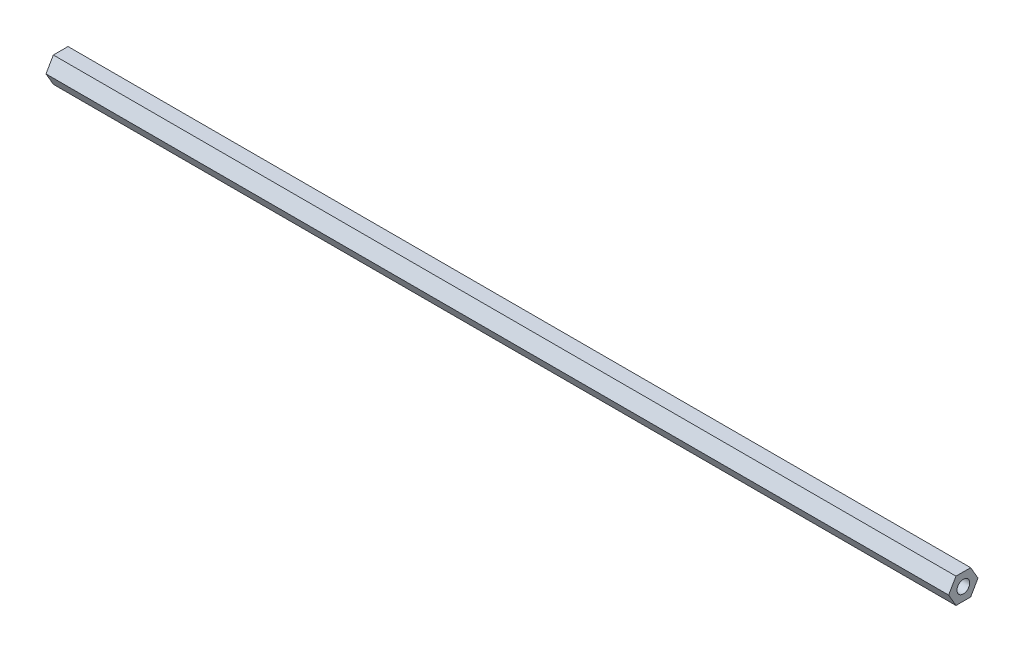
ISO-10303-21;
HEADER;
FILE_DESCRIPTION(('STEP AP214'),'2;1');
FILE_NAME('part.step','',(''),(''),'','','');
FILE_SCHEMA(('AUTOMOTIVE_DESIGN { 1 0 10303 214 1 1 1 1 }'));
ENDSEC;
DATA;
#1=APPLICATION_CONTEXT('core data for automotive mechanical design processes');
#2=APPLICATION_PROTOCOL_DEFINITION('international standard','automotive_design',2000,#1);
#3=PRODUCT_CONTEXT('',#1,'mechanical');
#4=PRODUCT('Part','Part','',(#3));
#5=PRODUCT_RELATED_PRODUCT_CATEGORY('part','',(#4));
#6=PRODUCT_DEFINITION_FORMATION('','',#4);
#7=PRODUCT_DEFINITION_CONTEXT('part definition',#1,'design');
#8=PRODUCT_DEFINITION('design','',#6,#7);
#9=PRODUCT_DEFINITION_SHAPE('','',#8);
#10=(LENGTH_UNIT() NAMED_UNIT(*) SI_UNIT(.MILLI.,.METRE.));
#11=(NAMED_UNIT(*) PLANE_ANGLE_UNIT() SI_UNIT($,.RADIAN.));
#12=(NAMED_UNIT(*) SI_UNIT($,.STERADIAN.) SOLID_ANGLE_UNIT());
#13=UNCERTAINTY_MEASURE_WITH_UNIT(LENGTH_MEASURE(1.E-05),#10,'distance_accuracy_value','');
#14=(GEOMETRIC_REPRESENTATION_CONTEXT(3) GLOBAL_UNCERTAINTY_ASSIGNED_CONTEXT((#13)) GLOBAL_UNIT_ASSIGNED_CONTEXT((#10,
#11,#12)) REPRESENTATION_CONTEXT('',''));
#15=CARTESIAN_POINT('',(0.,0.,0.));
#16=DIRECTION('',(0.,0.,1.));
#17=DIRECTION('',(1.,0.,0.));
#18=AXIS2_PLACEMENT_3D('',#15,#16,#17);
#19=CARTESIAN_POINT('',(225.425,0.,0.));
#20=DIRECTION('',(1.,0.,0.));
#21=DIRECTION('',(0.,0.,-1.));
#22=AXIS2_PLACEMENT_3D('',#19,#20,#21);
#23=PLANE('',#22);
#24=DIRECTION('',(0.,0.,1.));
#25=VECTOR('',#24,1.);
#26=CARTESIAN_POINT('',(225.425,6.35000000000005,-3.6661742093542));
#27=LINE('',#26,#25);
#28=CARTESIAN_POINT('',(225.425,6.35000000000005,-3.6661742093542));
#29=VERTEX_POINT('',#28);
#30=CARTESIAN_POINT('',(225.425,6.35000000000005,3.66617420935406));
#31=VERTEX_POINT('',#30);
#32=EDGE_CURVE('E131',#29,#31,#27,.T.);
#33=ORIENTED_EDGE('',*,*,#32,.T.);
#34=DIRECTION('',(0.,-0.866025403784436,0.500000000000004));
#35=VECTOR('',#34,1.);
#36=CARTESIAN_POINT('',(225.425,6.35000000000005,3.66617420935406));
#37=LINE('',#36,#35);
#38=CARTESIAN_POINT('',(225.425,0.,7.33234841870825));
#39=VERTEX_POINT('',#38);
#40=EDGE_CURVE('E89',#31,#39,#37,.T.);
#41=ORIENTED_EDGE('',*,*,#40,.T.);
#42=DIRECTION('',(0.,-0.866025403784429,-0.500000000000017));
#43=VECTOR('',#42,1.);
#44=CARTESIAN_POINT('',(225.425,0.,7.33234841870825));
#45=LINE('',#44,#43);
#46=CARTESIAN_POINT('',(225.425,-6.34999999999997,3.66617420935397));
#47=VERTEX_POINT('',#46);
#48=EDGE_CURVE('E102',#39,#47,#45,.T.);
#49=ORIENTED_EDGE('',*,*,#48,.T.);
#50=DIRECTION('',(0.,0.,-1.));
#51=VECTOR('',#50,1.);
#52=CARTESIAN_POINT('',(225.425,-6.34999999999997,3.66617420935397));
#53=LINE('',#52,#51);
#54=CARTESIAN_POINT('',(225.425,-6.34999999999999,-3.6661742093542));
#55=VERTEX_POINT('',#54);
#56=EDGE_CURVE('E96',#47,#55,#53,.T.);
#57=ORIENTED_EDGE('',*,*,#56,.T.);
#58=DIRECTION('',(0.,0.866025403784438,-0.5));
#59=VECTOR('',#58,1.);
#60=CARTESIAN_POINT('',(225.425,-6.34999999999999,-3.6661742093542));
#61=LINE('',#60,#59);
#62=CARTESIAN_POINT('',(225.425,0.,-7.33234841870833));
#63=VERTEX_POINT('',#62);
#64=EDGE_CURVE('E100',#55,#63,#61,.T.);
#65=ORIENTED_EDGE('',*,*,#64,.T.);
#66=DIRECTION('',(0.,0.866025403784438,0.5));
#67=VECTOR('',#66,1.);
#68=CARTESIAN_POINT('',(225.425,0.,-7.33234841870833));
#69=LINE('',#68,#67);
#70=EDGE_CURVE('E52',#63,#29,#69,.T.);
#71=ORIENTED_EDGE('',*,*,#70,.T.);
#72=EDGE_LOOP('',(#33,#41,#49,#57,#65,#71));
#73=FACE_BOUND('',#72,.T.);
#74=CARTESIAN_POINT('',(225.425,0.,0.));
#75=DIRECTION('',(1.,0.,0.));
#76=DIRECTION('',(0.,0.,-1.));
#77=AXIS2_PLACEMENT_3D('',#74,#75,#76);
#78=CIRCLE('',#77,3.17500000000001);
#79=CARTESIAN_POINT('',(225.425,0.,3.17500000000001));
#80=VERTEX_POINT('',#79);
#81=EDGE_CURVE('E124',#80,#80,#78,.T.);
#82=ORIENTED_EDGE('',*,*,#81,.F.);
#83=EDGE_LOOP('',(#82));
#84=FACE_BOUND('',#83,.T.);
#85=ADVANCED_FACE('F35',(#73,#84),#23,.T.);
#86=CARTESIAN_POINT('',(-225.425,0.,0.));
#87=DIRECTION('',(1.,0.,0.));
#88=DIRECTION('',(0.,0.,-1.));
#89=AXIS2_PLACEMENT_3D('',#86,#87,#88);
#90=PLANE('',#89);
#91=DIRECTION('',(0.,0.,1.));
#92=VECTOR('',#91,1.);
#93=CARTESIAN_POINT('',(-225.425,6.35000000000005,-3.6661742093542));
#94=LINE('',#93,#92);
#95=CARTESIAN_POINT('',(-225.425,6.35000000000005,-3.6661742093542));
#96=VERTEX_POINT('',#95);
#97=CARTESIAN_POINT('',(-225.425,6.35000000000005,3.66617420935406));
#98=VERTEX_POINT('',#97);
#99=EDGE_CURVE('E120',#96,#98,#94,.T.);
#100=ORIENTED_EDGE('',*,*,#99,.F.);
#101=DIRECTION('',(0.,0.866025403784438,0.5));
#102=VECTOR('',#101,1.);
#103=CARTESIAN_POINT('',(-225.425,0.,-7.33234841870833));
#104=LINE('',#103,#102);
#105=CARTESIAN_POINT('',(-225.425,0.,-7.33234841870833));
#106=VERTEX_POINT('',#105);
#107=EDGE_CURVE('E81',#106,#96,#104,.T.);
#108=ORIENTED_EDGE('',*,*,#107,.F.);
#109=DIRECTION('',(0.,0.866025403784438,-0.5));
#110=VECTOR('',#109,1.);
#111=CARTESIAN_POINT('',(-225.425,-6.34999999999999,-3.6661742093542));
#112=LINE('',#111,#110);
#113=CARTESIAN_POINT('',(-225.425,-6.34999999999999,-3.6661742093542));
#114=VERTEX_POINT('',#113);
#115=EDGE_CURVE('E75',#114,#106,#112,.T.);
#116=ORIENTED_EDGE('',*,*,#115,.F.);
#117=DIRECTION('',(0.,0.,-1.));
#118=VECTOR('',#117,1.);
#119=CARTESIAN_POINT('',(-225.425,-6.34999999999997,3.66617420935397));
#120=LINE('',#119,#118);
#121=CARTESIAN_POINT('',(-225.425,-6.34999999999997,3.66617420935397));
#122=VERTEX_POINT('',#121);
#123=EDGE_CURVE('E110',#122,#114,#120,.T.);
#124=ORIENTED_EDGE('',*,*,#123,.F.);
#125=DIRECTION('',(0.,-0.866025403784429,-0.500000000000017));
#126=VECTOR('',#125,1.);
#127=CARTESIAN_POINT('',(-225.425,0.,7.33234841870825));
#128=LINE('',#127,#126);
#129=CARTESIAN_POINT('',(-225.425,0.,7.33234841870825));
#130=VERTEX_POINT('',#129);
#131=EDGE_CURVE('E126',#130,#122,#128,.T.);
#132=ORIENTED_EDGE('',*,*,#131,.F.);
#133=DIRECTION('',(0.,-0.866025403784436,0.500000000000004));
#134=VECTOR('',#133,1.);
#135=CARTESIAN_POINT('',(-225.425,6.35000000000005,3.66617420935406));
#136=LINE('',#135,#134);
#137=EDGE_CURVE('E123',#98,#130,#136,.T.);
#138=ORIENTED_EDGE('',*,*,#137,.F.);
#139=EDGE_LOOP('',(#100,#108,#116,#124,#132,#138));
#140=FACE_BOUND('',#139,.T.);
#141=CARTESIAN_POINT('',(-225.425,0.,0.));
#142=DIRECTION('',(1.,0.,0.));
#143=DIRECTION('',(0.,0.,-1.));
#144=AXIS2_PLACEMENT_3D('',#141,#142,#143);
#145=CIRCLE('',#144,3.17500000000001);
#146=CARTESIAN_POINT('',(-225.425,0.,3.17500000000001));
#147=VERTEX_POINT('',#146);
#148=EDGE_CURVE('E224',#147,#147,#145,.T.);
#149=ORIENTED_EDGE('',*,*,#148,.T.);
#150=EDGE_LOOP('',(#149));
#151=FACE_BOUND('',#150,.T.);
#152=ADVANCED_FACE('F140',(#140,#151),#90,.F.);
#153=CARTESIAN_POINT('',(225.425,6.35000000000005,-3.6661742093542));
#154=DIRECTION('',(0.,-1.,0.));
#155=DIRECTION('',(0.,0.,-1.));
#156=AXIS2_PLACEMENT_3D('',#153,#154,#155);
#157=PLANE('',#156);
#158=ORIENTED_EDGE('',*,*,#99,.T.);
#159=DIRECTION('',(-1.,0.,0.));
#160=VECTOR('',#159,1.);
#161=CARTESIAN_POINT('',(225.425,6.35000000000005,3.66617420935406));
#162=LINE('',#161,#160);
#163=EDGE_CURVE('E11',#31,#98,#162,.T.);
#164=ORIENTED_EDGE('',*,*,#163,.F.);
#165=ORIENTED_EDGE('',*,*,#32,.F.);
#166=DIRECTION('',(-1.,0.,0.));
#167=VECTOR('',#166,1.);
#168=CARTESIAN_POINT('',(225.425,6.35000000000005,-3.6661742093542));
#169=LINE('',#168,#167);
#170=EDGE_CURVE('E116',#29,#96,#169,.T.);
#171=ORIENTED_EDGE('',*,*,#170,.T.);
#172=EDGE_LOOP('',(#158,#164,#165,#171));
#173=FACE_BOUND('',#172,.T.);
#174=ADVANCED_FACE('F37',(#173),#157,.F.);
#175=CARTESIAN_POINT('',(225.425,6.35000000000005,3.66617420935406));
#176=DIRECTION('',(0.,-0.500000000000004,-0.866025403784436));
#177=DIRECTION('',(0.,0.866025403784436,-0.500000000000004));
#178=AXIS2_PLACEMENT_3D('',#175,#176,#177);
#179=PLANE('',#178);
#180=ORIENTED_EDGE('',*,*,#137,.T.);
#181=DIRECTION('',(-1.,0.,0.));
#182=VECTOR('',#181,1.);
#183=CARTESIAN_POINT('',(225.425,0.,7.33234841870825));
#184=LINE('',#183,#182);
#185=EDGE_CURVE('E44',#39,#130,#184,.T.);
#186=ORIENTED_EDGE('',*,*,#185,.F.);
#187=ORIENTED_EDGE('',*,*,#40,.F.);
#188=ORIENTED_EDGE('',*,*,#163,.T.);
#189=EDGE_LOOP('',(#180,#186,#187,#188));
#190=FACE_BOUND('',#189,.T.);
#191=ADVANCED_FACE('F165',(#190),#179,.F.);
#192=CARTESIAN_POINT('',(225.425,0.,7.33234841870825));
#193=DIRECTION('',(0.,0.500000000000017,-0.866025403784429));
#194=DIRECTION('',(0.,0.866025403784429,0.500000000000017));
#195=AXIS2_PLACEMENT_3D('',#192,#193,#194);
#196=PLANE('',#195);
#197=ORIENTED_EDGE('',*,*,#131,.T.);
#198=DIRECTION('',(-1.,0.,0.));
#199=VECTOR('',#198,1.);
#200=CARTESIAN_POINT('',(225.425,-6.34999999999997,3.66617420935397));
#201=LINE('',#200,#199);
#202=EDGE_CURVE('E111',#47,#122,#201,.T.);
#203=ORIENTED_EDGE('',*,*,#202,.F.);
#204=ORIENTED_EDGE('',*,*,#48,.F.);
#205=ORIENTED_EDGE('',*,*,#185,.T.);
#206=EDGE_LOOP('',(#197,#203,#204,#205));
#207=FACE_BOUND('',#206,.T.);
#208=ADVANCED_FACE('F137',(#207),#196,.F.);
#209=CARTESIAN_POINT('',(225.425,-6.34999999999997,3.66617420935397));
#210=DIRECTION('',(0.,1.,0.));
#211=DIRECTION('',(0.,0.,1.));
#212=AXIS2_PLACEMENT_3D('',#209,#210,#211);
#213=PLANE('',#212);
#214=ORIENTED_EDGE('',*,*,#123,.T.);
#215=DIRECTION('',(-1.,0.,0.));
#216=VECTOR('',#215,1.);
#217=CARTESIAN_POINT('',(225.425,-6.34999999999999,-3.6661742093542));
#218=LINE('',#217,#216);
#219=EDGE_CURVE('E107',#55,#114,#218,.T.);
#220=ORIENTED_EDGE('',*,*,#219,.F.);
#221=ORIENTED_EDGE('',*,*,#56,.F.);
#222=ORIENTED_EDGE('',*,*,#202,.T.);
#223=EDGE_LOOP('',(#214,#220,#221,#222));
#224=FACE_BOUND('',#223,.T.);
#225=ADVANCED_FACE('F108',(#224),#213,.F.);
#226=CARTESIAN_POINT('',(225.425,-6.34999999999999,-3.6661742093542));
#227=DIRECTION('',(0.,0.5,0.866025403784439));
#228=DIRECTION('',(0.,-0.866025403784439,0.5));
#229=AXIS2_PLACEMENT_3D('',#226,#227,#228);
#230=PLANE('',#229);
#231=ORIENTED_EDGE('',*,*,#115,.T.);
#232=DIRECTION('',(-1.,0.,0.));
#233=VECTOR('',#232,1.);
#234=CARTESIAN_POINT('',(225.425,0.,-7.33234841870833));
#235=LINE('',#234,#233);
#236=EDGE_CURVE('E112',#63,#106,#235,.T.);
#237=ORIENTED_EDGE('',*,*,#236,.F.);
#238=ORIENTED_EDGE('',*,*,#64,.F.);
#239=ORIENTED_EDGE('',*,*,#219,.T.);
#240=EDGE_LOOP('',(#231,#237,#238,#239));
#241=FACE_BOUND('',#240,.T.);
#242=ADVANCED_FACE('F114',(#241),#230,.F.);
#243=CARTESIAN_POINT('',(225.425,0.,-7.33234841870833));
#244=DIRECTION('',(0.,-0.5,0.866025403784438));
#245=DIRECTION('',(0.,-0.866025403784438,-0.5));
#246=AXIS2_PLACEMENT_3D('',#243,#244,#245);
#247=PLANE('',#246);
#248=ORIENTED_EDGE('',*,*,#107,.T.);
#249=ORIENTED_EDGE('',*,*,#170,.F.);
#250=ORIENTED_EDGE('',*,*,#70,.F.);
#251=ORIENTED_EDGE('',*,*,#236,.T.);
#252=EDGE_LOOP('',(#248,#249,#250,#251));
#253=FACE_BOUND('',#252,.T.);
#254=ADVANCED_FACE('F145',(#253),#247,.F.);
#255=CARTESIAN_POINT('',(225.425,0.,0.));
#256=DIRECTION('',(-1.,0.,0.));
#257=DIRECTION('',(0.,0.,1.));
#258=AXIS2_PLACEMENT_3D('',#255,#256,#257);
#259=CYLINDRICAL_SURFACE('',#258,3.17500000000001);
#260=CARTESIAN_POINT('',(225.425,0.,3.17500000000001));
#261=CARTESIAN_POINT('',(220.728645833333,0.,3.17500000000001));
#262=CARTESIAN_POINT('',(216.032291666667,0.,3.17500000000001));
#263=CARTESIAN_POINT('',(206.639583333333,0.,3.17500000000001));
#264=CARTESIAN_POINT('',(201.943229166667,0.,3.17500000000001));
#265=CARTESIAN_POINT('',(192.550520833333,0.,3.17500000000001));
#266=CARTESIAN_POINT('',(187.854166666667,0.,3.17500000000001));
#267=CARTESIAN_POINT('',(178.461458333333,0.,3.17500000000001));
#268=CARTESIAN_POINT('',(173.765104166667,0.,3.17500000000001));
#269=CARTESIAN_POINT('',(164.372395833333,0.,3.17500000000001));
#270=CARTESIAN_POINT('',(159.676041666667,0.,3.17500000000001));
#271=CARTESIAN_POINT('',(150.283333333333,0.,3.17500000000001));
#272=CARTESIAN_POINT('',(145.586979166667,0.,3.17500000000001));
#273=CARTESIAN_POINT('',(136.194270833333,0.,3.17500000000001));
#274=CARTESIAN_POINT('',(131.497916666667,0.,3.17500000000001));
#275=CARTESIAN_POINT('',(122.105208333333,0.,3.17500000000001));
#276=CARTESIAN_POINT('',(117.408854166667,0.,3.17500000000001));
#277=CARTESIAN_POINT('',(108.016145833333,0.,3.17500000000001));
#278=CARTESIAN_POINT('',(103.319791666667,0.,3.17500000000001));
#279=CARTESIAN_POINT('',(93.9270833333333,0.,3.17500000000001));
#280=CARTESIAN_POINT('',(89.2307291666666,0.,3.17500000000001));
#281=CARTESIAN_POINT('',(79.8380208333333,0.,3.17500000000001));
#282=CARTESIAN_POINT('',(75.1416666666666,0.,3.17500000000001));
#283=CARTESIAN_POINT('',(65.7489583333333,0.,3.17500000000001));
#284=CARTESIAN_POINT('',(61.0526041666666,0.,3.17500000000001));
#285=CARTESIAN_POINT('',(51.6598958333333,0.,3.17500000000001));
#286=CARTESIAN_POINT('',(46.9635416666666,0.,3.17500000000001));
#287=CARTESIAN_POINT('',(37.5708333333333,0.,3.17500000000001));
#288=CARTESIAN_POINT('',(32.8744791666666,0.,3.17500000000001));
#289=CARTESIAN_POINT('',(23.4817708333333,0.,3.17500000000001));
#290=CARTESIAN_POINT('',(18.7854166666666,0.,3.17500000000001));
#291=CARTESIAN_POINT('',(9.39270833333328,0.,3.17500000000001));
#292=CARTESIAN_POINT('',(4.69635416666661,0.,3.17500000000001));
#293=CARTESIAN_POINT('',(-4.69635416666672,0.,3.17500000000001));
#294=CARTESIAN_POINT('',(-9.39270833333339,0.,3.17500000000001));
#295=CARTESIAN_POINT('',(-18.7854166666667,0.,3.17500000000001));
#296=CARTESIAN_POINT('',(-23.4817708333333,0.,3.17500000000001));
#297=CARTESIAN_POINT('',(-32.8744791666667,0.,3.17500000000001));
#298=CARTESIAN_POINT('',(-37.5708333333334,0.,3.17500000000001));
#299=CARTESIAN_POINT('',(-46.9635416666667,0.,3.17500000000001));
#300=CARTESIAN_POINT('',(-51.6598958333333,0.,3.17500000000001));
#301=CARTESIAN_POINT('',(-61.0526041666667,0.,3.17500000000001));
#302=CARTESIAN_POINT('',(-65.7489583333333,0.,3.17500000000001));
#303=CARTESIAN_POINT('',(-75.1416666666667,0.,3.17500000000001));
#304=CARTESIAN_POINT('',(-79.8380208333333,0.,3.17500000000001));
#305=CARTESIAN_POINT('',(-89.2307291666667,0.,3.17500000000001));
#306=CARTESIAN_POINT('',(-93.9270833333333,0.,3.17500000000001));
#307=CARTESIAN_POINT('',(-103.319791666667,0.,3.17500000000001));
#308=CARTESIAN_POINT('',(-108.016145833333,0.,3.17500000000001));
#309=CARTESIAN_POINT('',(-117.408854166667,0.,3.17500000000001));
#310=CARTESIAN_POINT('',(-122.105208333333,0.,3.17500000000001));
#311=CARTESIAN_POINT('',(-131.497916666667,0.,3.17500000000001));
#312=CARTESIAN_POINT('',(-136.194270833333,0.,3.17500000000001));
#313=CARTESIAN_POINT('',(-145.586979166667,0.,3.17500000000001));
#314=CARTESIAN_POINT('',(-150.283333333333,0.,3.17500000000001));
#315=CARTESIAN_POINT('',(-159.676041666667,0.,3.17500000000001));
#316=CARTESIAN_POINT('',(-164.372395833333,0.,3.17500000000001));
#317=CARTESIAN_POINT('',(-173.765104166667,0.,3.17500000000001));
#318=CARTESIAN_POINT('',(-178.461458333333,0.,3.17500000000001));
#319=CARTESIAN_POINT('',(-187.854166666667,0.,3.17500000000001));
#320=CARTESIAN_POINT('',(-192.550520833333,0.,3.17500000000001));
#321=CARTESIAN_POINT('',(-201.943229166667,0.,3.17500000000001));
#322=CARTESIAN_POINT('',(-206.639583333333,0.,3.17500000000001));
#323=CARTESIAN_POINT('',(-216.032291666667,0.,3.17500000000001));
#324=CARTESIAN_POINT('',(-220.728645833333,0.,3.17500000000001));
#325=CARTESIAN_POINT('',(-225.425,0.,3.17500000000001));
#326=B_SPLINE_CURVE_WITH_KNOTS('',3,(#260,#261,#262,#263,#264,#265,#266,#267,#268,#269,#270,
#271,#272,#273,#274,#275,#276,#277,#278,#279,#280,#281,#282,#283,#284,#285,#286,#287,#288,#289,
#290,#291,#292,#293,#294,#295,#296,#297,#298,#299,#300,#301,#302,#303,#304,#305,#306,#307,#308,
#309,#310,#311,#312,#313,#314,#315,#316,#317,#318,#319,#320,#321,#322,#323,#324,#325),
.UNSPECIFIED.,.F.,.F.,(4,2,2,2,2,2,2,2,2,2,2,2,2,2,2,2,2,2,2,2,2,2,2,2,2,2,2,2,2,2,2,2,4),(0.,
14.0890625,28.178125,42.2671875,56.35625,70.4453125,84.534375,98.6234375,112.7125,126.8015625,
140.890625,154.9796875,169.06875,183.1578125,197.246875,211.3359375,225.425,239.5140625,
253.603125,267.6921875,281.78125,295.8703125,309.959375,324.0484375,338.1375,352.2265625,
366.315625,380.4046875,394.49375,408.5828125,422.671875,436.7609375,450.85),.UNSPECIFIED.);
#327=EDGE_CURVE('BSEAM147',#80,#147,#326,.T.);
#328=ORIENTED_EDGE('',*,*,#81,.T.);
#329=ORIENTED_EDGE('',*,*,#148,.F.);
#330=ORIENTED_EDGE('',*,*,#327,.T.);
#331=ORIENTED_EDGE('',*,*,#327,.F.);
#332=EDGE_LOOP('',(#328,#330,#329,#331));
#333=FACE_BOUND('',#332,.T.);
#334=ADVANCED_FACE('F147',(#333),#259,.F.);
#335=CLOSED_SHELL('',(#85,#152,#174,#191,#208,#225,#242,#254,#334));
#336=MANIFOLD_SOLID_BREP('B2',#335);
#337=ADVANCED_BREP_SHAPE_REPRESENTATION('',(#18,#336),#14);
#338=SHAPE_DEFINITION_REPRESENTATION(#9,#337);
ENDSEC;
END-ISO-10303-21;
